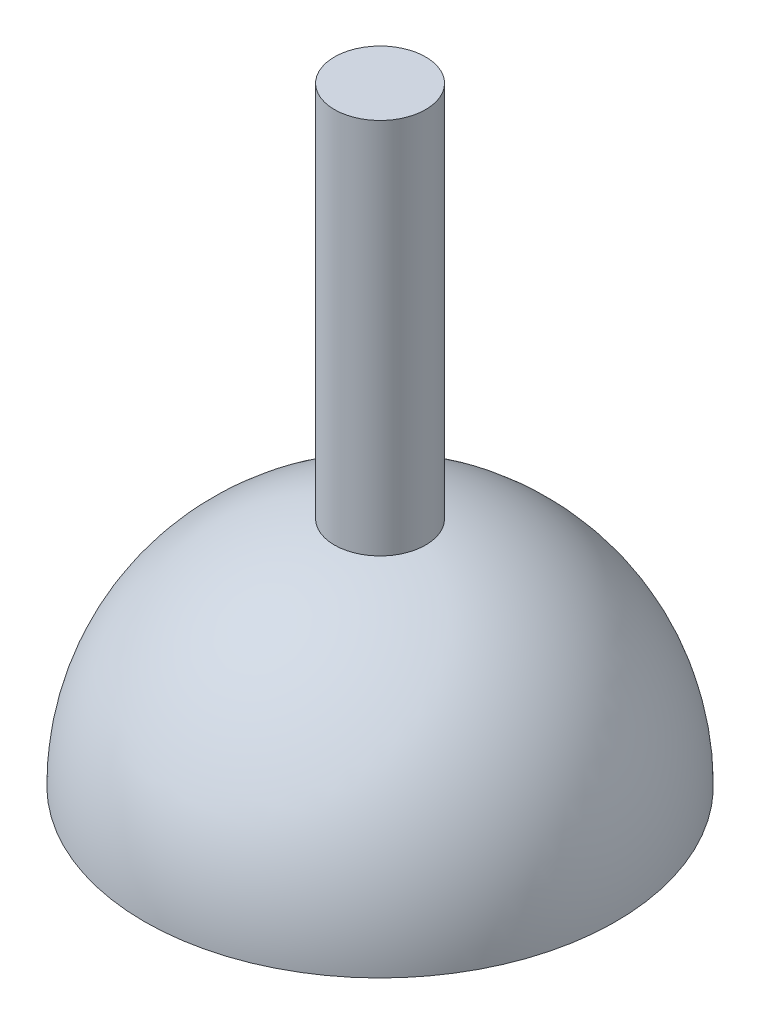
ISO-10303-21;
HEADER;
FILE_DESCRIPTION(('STEP AP214'),'2;1');
FILE_NAME('part.step','',(''),(''),'','','');
FILE_SCHEMA(('AUTOMOTIVE_DESIGN { 1 0 10303 214 1 1 1 1 }'));
ENDSEC;
DATA;
#1=APPLICATION_CONTEXT('core data for automotive mechanical design processes');
#2=APPLICATION_PROTOCOL_DEFINITION('international standard','automotive_design',2000,#1);
#3=PRODUCT_CONTEXT('',#1,'mechanical');
#4=PRODUCT('Part','Part','',(#3));
#5=PRODUCT_RELATED_PRODUCT_CATEGORY('part','',(#4));
#6=PRODUCT_DEFINITION_FORMATION('','',#4);
#7=PRODUCT_DEFINITION_CONTEXT('part definition',#1,'design');
#8=PRODUCT_DEFINITION('design','',#6,#7);
#9=PRODUCT_DEFINITION_SHAPE('','',#8);
#10=(LENGTH_UNIT() NAMED_UNIT(*) SI_UNIT(.MILLI.,.METRE.));
#11=(NAMED_UNIT(*) PLANE_ANGLE_UNIT() SI_UNIT($,.RADIAN.));
#12=(NAMED_UNIT(*) SI_UNIT($,.STERADIAN.) SOLID_ANGLE_UNIT());
#13=UNCERTAINTY_MEASURE_WITH_UNIT(LENGTH_MEASURE(1.E-05),#10,'distance_accuracy_value','');
#14=(GEOMETRIC_REPRESENTATION_CONTEXT(3) GLOBAL_UNCERTAINTY_ASSIGNED_CONTEXT((#13)) GLOBAL_UNIT_ASSIGNED_CONTEXT((#10,
#11,#12)) REPRESENTATION_CONTEXT('',''));
#15=CARTESIAN_POINT('',(0.,0.,0.));
#16=DIRECTION('',(0.,0.,1.));
#17=DIRECTION('',(1.,0.,0.));
#18=AXIS2_PLACEMENT_3D('',#15,#16,#17);
#19=CARTESIAN_POINT('',(0.,80.,0.));
#20=DIRECTION('',(0.,-1.,0.));
#21=DIRECTION('',(0.,0.,-1.));
#22=AXIS2_PLACEMENT_3D('',#19,#20,#21);
#23=CYLINDRICAL_SURFACE('',#22,6.);
#24=CARTESIAN_POINT('',(0.,80.,0.));
#25=DIRECTION('',(0.,1.,0.));
#26=DIRECTION('',(0.,0.,1.));
#27=AXIS2_PLACEMENT_3D('',#24,#25,#26);
#28=CIRCLE('',#27,6.);
#29=CARTESIAN_POINT('',(0.,80.,6.));
#30=VERTEX_POINT('',#29);
#31=EDGE_CURVE('E11',#30,#30,#28,.T.);
#32=ORIENTED_EDGE('',*,*,#31,.F.);
#33=EDGE_LOOP('',(#32));
#34=FACE_BOUND('',#33,.T.);
#35=CARTESIAN_POINT('',(0.,30.,0.));
#36=DIRECTION('',(0.,1.,0.));
#37=DIRECTION('',(0.,0.,1.));
#38=AXIS2_PLACEMENT_3D('',#35,#36,#37);
#39=CIRCLE('',#38,6.);
#40=CARTESIAN_POINT('',(0.,30.,6.));
#41=VERTEX_POINT('',#40);
#42=EDGE_CURVE('E45',#41,#41,#39,.T.);
#43=ORIENTED_EDGE('',*,*,#42,.T.);
#44=EDGE_LOOP('',(#43));
#45=FACE_BOUND('',#44,.T.);
#46=ADVANCED_FACE('F42',(#34,#45),#23,.T.);
#47=CARTESIAN_POINT('',(0.,80.,0.));
#48=DIRECTION('',(0.,1.,0.));
#49=DIRECTION('',(0.,0.,1.));
#50=AXIS2_PLACEMENT_3D('',#47,#48,#49);
#51=PLANE('',#50);
#52=ORIENTED_EDGE('',*,*,#31,.T.);
#53=EDGE_LOOP('',(#52));
#54=FACE_BOUND('',#53,.T.);
#55=ADVANCED_FACE('F57',(#54),#51,.T.);
#56=CARTESIAN_POINT('',(0.,30.,0.));
#57=DIRECTION('',(0.,1.,0.));
#58=DIRECTION('',(0.,0.,1.));
#59=AXIS2_PLACEMENT_3D('',#56,#57,#58);
#60=PLANE('',#59);
#61=ORIENTED_EDGE('',*,*,#42,.F.);
#62=EDGE_LOOP('',(#61));
#63=FACE_BOUND('',#62,.T.);
#64=ADVANCED_FACE('F55',(#63),#60,.F.);
#65=CLOSED_SHELL('',(#46,#55,#64));
#66=MANIFOLD_SOLID_BREP('B2',#65);
#67=CARTESIAN_POINT('',(0.,0.,0.));
#68=DIRECTION('',(0.,0.,1.));
#69=DIRECTION('',(-1.,0.,0.));
#70=AXIS2_PLACEMENT_3D('',#67,#68,#69);
#71=SPHERICAL_SURFACE('',#70,31.);
#72=CARTESIAN_POINT('',(0.,0.,0.));
#73=DIRECTION('',(0.,1.,0.));
#74=DIRECTION('',(0.,0.,1.));
#75=AXIS2_PLACEMENT_3D('',#72,#73,#74);
#76=SPHERICAL_SURFACE('',#75,31.);
#77=CARTESIAN_POINT('',(0.,0.,0.));
#78=DIRECTION('',(0.,1.,0.));
#79=DIRECTION('',(0.,0.,1.));
#80=AXIS2_PLACEMENT_3D('',#77,#78,#79);
#81=CIRCLE('',#80,31.);
#82=CARTESIAN_POINT('',(0.,0.,31.));
#83=VERTEX_POINT('',#82);
#84=EDGE_CURVE('E88',#83,#83,#81,.T.);
#85=ORIENTED_EDGE('',*,*,#84,.T.);
#86=EDGE_LOOP('',(#85));
#87=FACE_BOUND('',#86,.T.);
#88=ADVANCED_FACE('F82',(#87),#76,.T.);
#89=CARTESIAN_POINT('',(0.,0.,0.));
#90=DIRECTION('',(0.,1.,0.));
#91=DIRECTION('',(0.,0.,1.));
#92=AXIS2_PLACEMENT_3D('',#89,#90,#91);
#93=PLANE('',#92);
#94=ORIENTED_EDGE('',*,*,#84,.F.);
#95=EDGE_LOOP('',(#94));
#96=FACE_BOUND('',#95,.T.);
#97=CARTESIAN_POINT('',(0.,0.,0.));
#98=DIRECTION('',(0.,1.,0.));
#99=DIRECTION('',(0.,0.,1.));
#100=AXIS2_PLACEMENT_3D('',#97,#98,#99);
#101=CIRCLE('',#100,30.);
#102=CARTESIAN_POINT('',(0.,0.,30.));
#103=VERTEX_POINT('',#102);
#104=EDGE_CURVE('E41',#103,#103,#101,.F.);
#105=ORIENTED_EDGE('',*,*,#104,.F.);
#106=EDGE_LOOP('',(#105));
#107=FACE_BOUND('',#106,.T.);
#108=ADVANCED_FACE('F95',(#96,#107),#93,.F.);
#109=CARTESIAN_POINT('',(0.,0.,0.));
#110=DIRECTION('',(0.,0.,1.));
#111=DIRECTION('',(-1.,0.,0.));
#112=AXIS2_PLACEMENT_3D('',#109,#110,#111);
#113=SPHERICAL_SURFACE('',#112,30.);
#114=CARTESIAN_POINT('',(0.,0.,0.));
#115=DIRECTION('',(0.,1.,0.));
#116=DIRECTION('',(0.,0.,1.));
#117=AXIS2_PLACEMENT_3D('',#114,#115,#116);
#118=SPHERICAL_SURFACE('',#117,30.);
#119=ORIENTED_EDGE('',*,*,#104,.T.);
#120=EDGE_LOOP('',(#119));
#121=FACE_BOUND('',#120,.T.);
#122=ADVANCED_FACE('F98',(#121),#118,.F.);
#123=CLOSED_SHELL('',(#88,#108,#122));
#124=MANIFOLD_SOLID_BREP('B6',#123);
#125=ADVANCED_BREP_SHAPE_REPRESENTATION('',(#18,#66,#124),#14);
#126=SHAPE_DEFINITION_REPRESENTATION(#9,#125);
ENDSEC;
END-ISO-10303-21;
